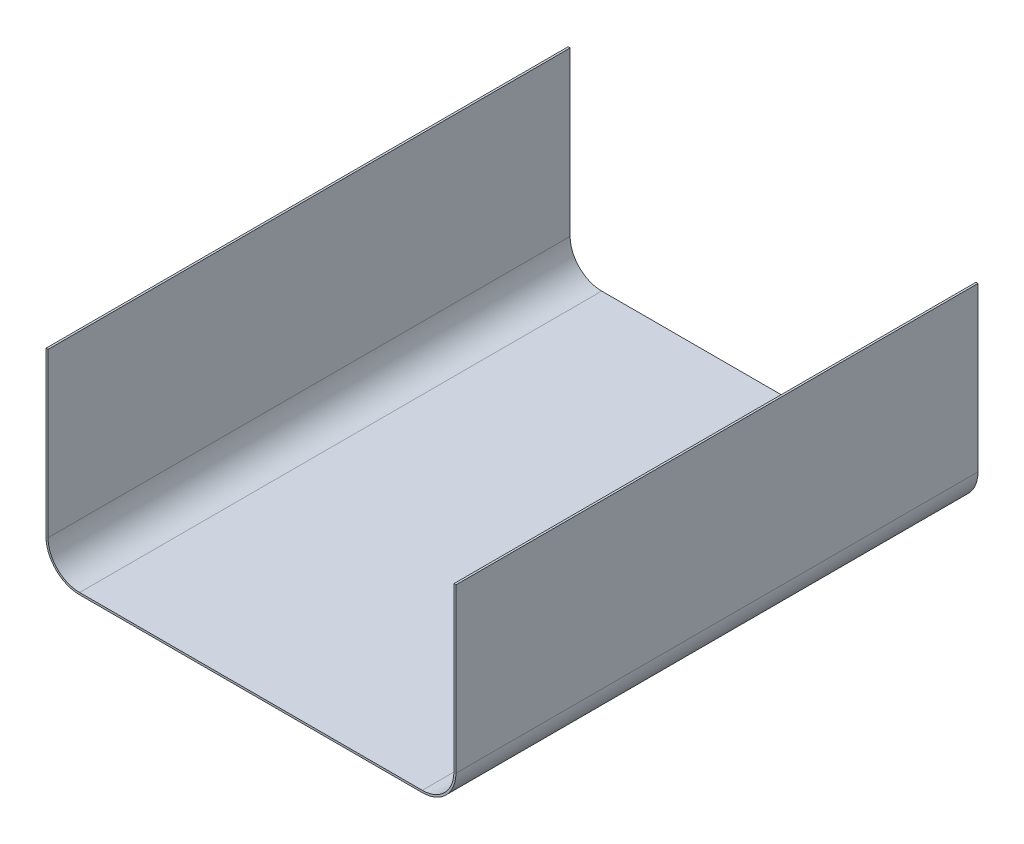
ISO-10303-21;
HEADER;
FILE_DESCRIPTION(('STEP AP214'),'2;1');
FILE_NAME('part.step','',(''),(''),'','','');
FILE_SCHEMA(('AUTOMOTIVE_DESIGN { 1 0 10303 214 1 1 1 1 }'));
ENDSEC;
DATA;
#1=APPLICATION_CONTEXT('core data for automotive mechanical design processes');
#2=APPLICATION_PROTOCOL_DEFINITION('international standard','automotive_design',2000,#1);
#3=PRODUCT_CONTEXT('',#1,'mechanical');
#4=PRODUCT('Part','Part','',(#3));
#5=PRODUCT_RELATED_PRODUCT_CATEGORY('part','',(#4));
#6=PRODUCT_DEFINITION_FORMATION('','',#4);
#7=PRODUCT_DEFINITION_CONTEXT('part definition',#1,'design');
#8=PRODUCT_DEFINITION('design','',#6,#7);
#9=PRODUCT_DEFINITION_SHAPE('','',#8);
#10=(LENGTH_UNIT() NAMED_UNIT(*) SI_UNIT(.MILLI.,.METRE.));
#11=(NAMED_UNIT(*) PLANE_ANGLE_UNIT() SI_UNIT($,.RADIAN.));
#12=(NAMED_UNIT(*) SI_UNIT($,.STERADIAN.) SOLID_ANGLE_UNIT());
#13=UNCERTAINTY_MEASURE_WITH_UNIT(LENGTH_MEASURE(1.E-05),#10,'distance_accuracy_value','');
#14=(GEOMETRIC_REPRESENTATION_CONTEXT(3) GLOBAL_UNCERTAINTY_ASSIGNED_CONTEXT((#13)) GLOBAL_UNIT_ASSIGNED_CONTEXT((#10,
#11,#12)) REPRESENTATION_CONTEXT('',''));
#15=CARTESIAN_POINT('',(0.,0.,0.));
#16=DIRECTION('',(0.,0.,1.));
#17=DIRECTION('',(1.,0.,0.));
#18=AXIS2_PLACEMENT_3D('',#15,#16,#17);
#19=CARTESIAN_POINT('',(0.,0.,406.4));
#20=DIRECTION('',(0.,1.,0.));
#21=DIRECTION('',(0.,0.,1.));
#22=AXIS2_PLACEMENT_3D('',#19,#20,#21);
#23=PLANE('',#22);
#24=DIRECTION('',(1.,0.,0.));
#25=VECTOR('',#24,1.);
#26=CARTESIAN_POINT('',(0.,0.,0.));
#27=LINE('',#26,#25);
#28=CARTESIAN_POINT('',(-0.79375,0.,0.));
#29=VERTEX_POINT('',#28);
#30=CARTESIAN_POINT('',(0.79375,0.,0.));
#31=VERTEX_POINT('',#30);
#32=EDGE_CURVE('E155',#29,#31,#27,.T.);
#33=ORIENTED_EDGE('',*,*,#32,.F.);
#34=DIRECTION('',(0.,0.,-1.));
#35=VECTOR('',#34,1.);
#36=CARTESIAN_POINT('',(-0.79375,0.,406.4));
#37=LINE('',#36,#35);
#38=CARTESIAN_POINT('',(-0.79375,0.,406.4));
#39=VERTEX_POINT('',#38);
#40=EDGE_CURVE('E11',#39,#29,#37,.T.);
#41=ORIENTED_EDGE('',*,*,#40,.F.);
#42=DIRECTION('',(1.,0.,0.));
#43=VECTOR('',#42,1.);
#44=CARTESIAN_POINT('',(0.,0.,406.4));
#45=LINE('',#44,#43);
#46=CARTESIAN_POINT('',(0.79375,0.,406.4));
#47=VERTEX_POINT('',#46);
#48=EDGE_CURVE('E185',#39,#47,#45,.T.);
#49=ORIENTED_EDGE('',*,*,#48,.T.);
#50=DIRECTION('',(0.,0.,-1.));
#51=VECTOR('',#50,1.);
#52=CARTESIAN_POINT('',(0.79375,0.,406.4));
#53=LINE('',#52,#51);
#54=EDGE_CURVE('E51',#47,#31,#53,.T.);
#55=ORIENTED_EDGE('',*,*,#54,.T.);
#56=EDGE_LOOP('',(#33,#41,#49,#55));
#57=FACE_BOUND('',#56,.T.);
#58=ADVANCED_FACE('F35',(#57),#23,.T.);
#59=CARTESIAN_POINT('',(-0.79375,0.,406.4));
#60=DIRECTION('',(1.,0.,0.));
#61=DIRECTION('',(0.,0.,-1.));
#62=AXIS2_PLACEMENT_3D('',#59,#60,#61);
#63=PLANE('',#62);
#64=DIRECTION('',(0.,-1.,0.));
#65=VECTOR('',#64,1.);
#66=CARTESIAN_POINT('',(-0.79375,0.,0.));
#67=LINE('',#66,#65);
#68=CARTESIAN_POINT('',(-0.79375,-127.,0.));
#69=VERTEX_POINT('',#68);
#70=EDGE_CURVE('E157',#29,#69,#67,.T.);
#71=ORIENTED_EDGE('',*,*,#70,.T.);
#72=DIRECTION('',(0.,0.,-1.));
#73=VECTOR('',#72,1.);
#74=CARTESIAN_POINT('',(-0.79375,-127.,406.4));
#75=LINE('',#74,#73);
#76=CARTESIAN_POINT('',(-0.79375,-127.,406.4));
#77=VERTEX_POINT('',#76);
#78=EDGE_CURVE('E43',#77,#69,#75,.T.);
#79=ORIENTED_EDGE('',*,*,#78,.F.);
#80=DIRECTION('',(0.,-1.,0.));
#81=VECTOR('',#80,1.);
#82=CARTESIAN_POINT('',(-0.79375,0.,406.4));
#83=LINE('',#82,#81);
#84=EDGE_CURVE('E368',#39,#77,#83,.T.);
#85=ORIENTED_EDGE('',*,*,#84,.F.);
#86=ORIENTED_EDGE('',*,*,#40,.T.);
#87=EDGE_LOOP('',(#71,#79,#85,#86));
#88=FACE_BOUND('',#87,.T.);
#89=ADVANCED_FACE('F211',(#88),#63,.F.);
#90=CARTESIAN_POINT('',(25.4,-127.,406.4));
#91=DIRECTION('',(0.,0.,-1.));
#92=DIRECTION('',(-1.,0.,0.));
#93=AXIS2_PLACEMENT_3D('',#90,#91,#92);
#94=CYLINDRICAL_SURFACE('',#93,26.19375);
#95=CARTESIAN_POINT('',(25.4,-127.,0.));
#96=DIRECTION('',(0.,0.,1.));
#97=DIRECTION('',(1.,0.,0.));
#98=AXIS2_PLACEMENT_3D('',#95,#96,#97);
#99=CIRCLE('',#98,26.19375);
#100=CARTESIAN_POINT('',(25.4000000000002,-153.19375,0.));
#101=VERTEX_POINT('',#100);
#102=EDGE_CURVE('E160',#101,#69,#99,.F.);
#103=ORIENTED_EDGE('',*,*,#102,.F.);
#104=DIRECTION('',(0.,0.,-1.));
#105=VECTOR('',#104,1.);
#106=CARTESIAN_POINT('',(25.4000000000002,-153.19375,406.4));
#107=LINE('',#106,#105);
#108=CARTESIAN_POINT('',(25.4000000000002,-153.19375,406.4));
#109=VERTEX_POINT('',#108);
#110=EDGE_CURVE('E201',#109,#101,#107,.T.);
#111=ORIENTED_EDGE('',*,*,#110,.F.);
#112=CARTESIAN_POINT('',(25.4,-127.,406.4));
#113=DIRECTION('',(0.,0.,1.));
#114=DIRECTION('',(1.,0.,0.));
#115=AXIS2_PLACEMENT_3D('',#112,#113,#114);
#116=CIRCLE('',#115,26.19375);
#117=EDGE_CURVE('E208',#109,#77,#116,.F.);
#118=ORIENTED_EDGE('',*,*,#117,.T.);
#119=ORIENTED_EDGE('',*,*,#78,.T.);
#120=EDGE_LOOP('',(#103,#111,#118,#119));
#121=FACE_BOUND('',#120,.T.);
#122=ADVANCED_FACE('F206',(#121),#94,.T.);
#123=CARTESIAN_POINT('',(0.,-153.19375,406.4));
#124=DIRECTION('',(0.,1.,0.));
#125=DIRECTION('',(0.,0.,1.));
#126=AXIS2_PLACEMENT_3D('',#123,#124,#125);
#127=PLANE('',#126);
#128=DIRECTION('',(1.,0.,0.));
#129=VECTOR('',#128,1.);
#130=CARTESIAN_POINT('',(0.,-153.19375,0.));
#131=LINE('',#130,#129);
#132=CARTESIAN_POINT('',(292.1,-153.19375,0.));
#133=VERTEX_POINT('',#132);
#134=EDGE_CURVE('E163',#101,#133,#131,.T.);
#135=ORIENTED_EDGE('',*,*,#134,.T.);
#136=DIRECTION('',(0.,0.,-1.));
#137=VECTOR('',#136,1.);
#138=CARTESIAN_POINT('',(292.1,-153.19375,406.4));
#139=LINE('',#138,#137);
#140=CARTESIAN_POINT('',(292.1,-153.19375,406.4));
#141=VERTEX_POINT('',#140);
#142=EDGE_CURVE('E198',#141,#133,#139,.T.);
#143=ORIENTED_EDGE('',*,*,#142,.F.);
#144=DIRECTION('',(1.,0.,0.));
#145=VECTOR('',#144,1.);
#146=CARTESIAN_POINT('',(0.,-153.19375,406.4));
#147=LINE('',#146,#145);
#148=EDGE_CURVE('E228',#109,#141,#147,.T.);
#149=ORIENTED_EDGE('',*,*,#148,.F.);
#150=ORIENTED_EDGE('',*,*,#110,.T.);
#151=EDGE_LOOP('',(#135,#143,#149,#150));
#152=FACE_BOUND('',#151,.T.);
#153=ADVANCED_FACE('F219',(#152),#127,.F.);
#154=CARTESIAN_POINT('',(292.1,-127.,406.4));
#155=DIRECTION('',(0.,0.,-1.));
#156=DIRECTION('',(-1.,0.,0.));
#157=AXIS2_PLACEMENT_3D('',#154,#155,#156);
#158=CYLINDRICAL_SURFACE('',#157,26.19375);
#159=CARTESIAN_POINT('',(292.1,-127.,0.));
#160=DIRECTION('',(0.,0.,1.));
#161=DIRECTION('',(1.,0.,0.));
#162=AXIS2_PLACEMENT_3D('',#159,#160,#161);
#163=CIRCLE('',#162,26.19375);
#164=CARTESIAN_POINT('',(318.29375,-127.,0.));
#165=VERTEX_POINT('',#164);
#166=EDGE_CURVE('E165',#133,#165,#163,.T.);
#167=ORIENTED_EDGE('',*,*,#166,.T.);
#168=DIRECTION('',(0.,0.,-1.));
#169=VECTOR('',#168,1.);
#170=CARTESIAN_POINT('',(318.29375,-127.,406.4));
#171=LINE('',#170,#169);
#172=CARTESIAN_POINT('',(318.29375,-127.,406.4));
#173=VERTEX_POINT('',#172);
#174=EDGE_CURVE('E195',#173,#165,#171,.T.);
#175=ORIENTED_EDGE('',*,*,#174,.F.);
#176=CARTESIAN_POINT('',(292.1,-127.,406.4));
#177=DIRECTION('',(0.,0.,1.));
#178=DIRECTION('',(1.,0.,0.));
#179=AXIS2_PLACEMENT_3D('',#176,#177,#178);
#180=CIRCLE('',#179,26.19375);
#181=EDGE_CURVE('E225',#141,#173,#180,.T.);
#182=ORIENTED_EDGE('',*,*,#181,.F.);
#183=ORIENTED_EDGE('',*,*,#142,.T.);
#184=EDGE_LOOP('',(#167,#175,#182,#183));
#185=FACE_BOUND('',#184,.T.);
#186=ADVANCED_FACE('F223',(#185),#158,.T.);
#187=CARTESIAN_POINT('',(318.29375,0.,406.4));
#188=DIRECTION('',(-1.,0.,0.));
#189=DIRECTION('',(0.,0.,1.));
#190=AXIS2_PLACEMENT_3D('',#187,#188,#189);
#191=PLANE('',#190);
#192=DIRECTION('',(0.,1.,0.));
#193=VECTOR('',#192,1.);
#194=CARTESIAN_POINT('',(318.29375,0.,0.));
#195=LINE('',#194,#193);
#196=CARTESIAN_POINT('',(318.29375,0.,0.));
#197=VERTEX_POINT('',#196);
#198=EDGE_CURVE('E167',#165,#197,#195,.T.);
#199=ORIENTED_EDGE('',*,*,#198,.T.);
#200=DIRECTION('',(0.,0.,-1.));
#201=VECTOR('',#200,1.);
#202=CARTESIAN_POINT('',(318.29375,0.,406.4));
#203=LINE('',#202,#201);
#204=CARTESIAN_POINT('',(318.29375,0.,406.4));
#205=VERTEX_POINT('',#204);
#206=EDGE_CURVE('E193',#205,#197,#203,.T.);
#207=ORIENTED_EDGE('',*,*,#206,.F.);
#208=DIRECTION('',(0.,1.,0.));
#209=VECTOR('',#208,1.);
#210=CARTESIAN_POINT('',(318.29375,0.,406.4));
#211=LINE('',#210,#209);
#212=EDGE_CURVE('E227',#173,#205,#211,.T.);
#213=ORIENTED_EDGE('',*,*,#212,.F.);
#214=ORIENTED_EDGE('',*,*,#174,.T.);
#215=EDGE_LOOP('',(#199,#207,#213,#214));
#216=FACE_BOUND('',#215,.T.);
#217=ADVANCED_FACE('F268',(#216),#191,.F.);
#218=CARTESIAN_POINT('',(0.,0.,406.4));
#219=DIRECTION('',(0.,1.,0.));
#220=DIRECTION('',(0.,0.,1.));
#221=AXIS2_PLACEMENT_3D('',#218,#219,#220);
#222=PLANE('',#221);
#223=DIRECTION('',(1.,0.,0.));
#224=VECTOR('',#223,1.);
#225=CARTESIAN_POINT('',(0.,0.,0.));
#226=LINE('',#225,#224);
#227=CARTESIAN_POINT('',(316.70625,0.,0.));
#228=VERTEX_POINT('',#227);
#229=EDGE_CURVE('E170',#228,#197,#226,.T.);
#230=ORIENTED_EDGE('',*,*,#229,.F.);
#231=DIRECTION('',(0.,0.,-1.));
#232=VECTOR('',#231,1.);
#233=CARTESIAN_POINT('',(316.70625,0.,406.4));
#234=LINE('',#233,#232);
#235=CARTESIAN_POINT('',(316.70625,0.,406.4));
#236=VERTEX_POINT('',#235);
#237=EDGE_CURVE('E191',#236,#228,#234,.T.);
#238=ORIENTED_EDGE('',*,*,#237,.F.);
#239=DIRECTION('',(1.,0.,0.));
#240=VECTOR('',#239,1.);
#241=CARTESIAN_POINT('',(0.,0.,406.4));
#242=LINE('',#241,#240);
#243=EDGE_CURVE('E230',#236,#205,#242,.T.);
#244=ORIENTED_EDGE('',*,*,#243,.T.);
#245=ORIENTED_EDGE('',*,*,#206,.T.);
#246=EDGE_LOOP('',(#230,#238,#244,#245));
#247=FACE_BOUND('',#246,.T.);
#248=ADVANCED_FACE('F271',(#247),#222,.T.);
#249=CARTESIAN_POINT('',(316.70625,0.,406.4));
#250=DIRECTION('',(-1.,0.,0.));
#251=DIRECTION('',(0.,0.,1.));
#252=AXIS2_PLACEMENT_3D('',#249,#250,#251);
#253=PLANE('',#252);
#254=DIRECTION('',(0.,1.,0.));
#255=VECTOR('',#254,1.);
#256=CARTESIAN_POINT('',(316.70625,0.,0.));
#257=LINE('',#256,#255);
#258=CARTESIAN_POINT('',(316.70625,-127.,0.));
#259=VERTEX_POINT('',#258);
#260=EDGE_CURVE('E173',#259,#228,#257,.T.);
#261=ORIENTED_EDGE('',*,*,#260,.F.);
#262=DIRECTION('',(0.,0.,-1.));
#263=VECTOR('',#262,1.);
#264=CARTESIAN_POINT('',(316.70625,-127.,406.4));
#265=LINE('',#264,#263);
#266=CARTESIAN_POINT('',(316.70625,-127.,406.4));
#267=VERTEX_POINT('',#266);
#268=EDGE_CURVE('E189',#267,#259,#265,.T.);
#269=ORIENTED_EDGE('',*,*,#268,.F.);
#270=DIRECTION('',(0.,1.,0.));
#271=VECTOR('',#270,1.);
#272=CARTESIAN_POINT('',(316.70625,0.,406.4));
#273=LINE('',#272,#271);
#274=EDGE_CURVE('E150',#267,#236,#273,.T.);
#275=ORIENTED_EDGE('',*,*,#274,.T.);
#276=ORIENTED_EDGE('',*,*,#237,.T.);
#277=EDGE_LOOP('',(#261,#269,#275,#276));
#278=FACE_BOUND('',#277,.T.);
#279=ADVANCED_FACE('F239',(#278),#253,.T.);
#280=CARTESIAN_POINT('',(292.1,-127.,406.4));
#281=DIRECTION('',(0.,0.,-1.));
#282=DIRECTION('',(-1.,0.,0.));
#283=AXIS2_PLACEMENT_3D('',#280,#281,#282);
#284=CYLINDRICAL_SURFACE('',#283,24.60625);
#285=CARTESIAN_POINT('',(292.1,-127.,0.));
#286=DIRECTION('',(0.,0.,1.));
#287=DIRECTION('',(1.,0.,0.));
#288=AXIS2_PLACEMENT_3D('',#285,#286,#287);
#289=CIRCLE('',#288,24.60625);
#290=CARTESIAN_POINT('',(292.1,-151.60625,0.));
#291=VERTEX_POINT('',#290);
#292=EDGE_CURVE('E176',#291,#259,#289,.T.);
#293=ORIENTED_EDGE('',*,*,#292,.F.);
#294=DIRECTION('',(0.,0.,-1.));
#295=VECTOR('',#294,1.);
#296=CARTESIAN_POINT('',(292.1,-151.60625,406.4));
#297=LINE('',#296,#295);
#298=CARTESIAN_POINT('',(292.1,-151.60625,406.4));
#299=VERTEX_POINT('',#298);
#300=EDGE_CURVE('E135',#299,#291,#297,.T.);
#301=ORIENTED_EDGE('',*,*,#300,.F.);
#302=CARTESIAN_POINT('',(292.1,-127.,406.4));
#303=DIRECTION('',(0.,0.,1.));
#304=DIRECTION('',(1.,0.,0.));
#305=AXIS2_PLACEMENT_3D('',#302,#303,#304);
#306=CIRCLE('',#305,24.60625);
#307=EDGE_CURVE('E148',#299,#267,#306,.T.);
#308=ORIENTED_EDGE('',*,*,#307,.T.);
#309=ORIENTED_EDGE('',*,*,#268,.T.);
#310=EDGE_LOOP('',(#293,#301,#308,#309));
#311=FACE_BOUND('',#310,.T.);
#312=ADVANCED_FACE('F244',(#311),#284,.F.);
#313=CARTESIAN_POINT('',(0.,-151.60625,406.4));
#314=DIRECTION('',(0.,1.,0.));
#315=DIRECTION('',(0.,0.,1.));
#316=AXIS2_PLACEMENT_3D('',#313,#314,#315);
#317=PLANE('',#316);
#318=DIRECTION('',(1.,0.,0.));
#319=VECTOR('',#318,1.);
#320=CARTESIAN_POINT('',(0.,-151.60625,0.));
#321=LINE('',#320,#319);
#322=CARTESIAN_POINT('',(25.4000000000002,-151.60625,0.));
#323=VERTEX_POINT('',#322);
#324=EDGE_CURVE('E132',#323,#291,#321,.T.);
#325=ORIENTED_EDGE('',*,*,#324,.F.);
#326=DIRECTION('',(0.,0.,-1.));
#327=VECTOR('',#326,1.);
#328=CARTESIAN_POINT('',(25.4000000000002,-151.60625,406.4));
#329=LINE('',#328,#327);
#330=CARTESIAN_POINT('',(25.4000000000002,-151.60625,406.4));
#331=VERTEX_POINT('',#330);
#332=EDGE_CURVE('E126',#331,#323,#329,.T.);
#333=ORIENTED_EDGE('',*,*,#332,.F.);
#334=DIRECTION('',(1.,0.,0.));
#335=VECTOR('',#334,1.);
#336=CARTESIAN_POINT('',(0.,-151.60625,406.4));
#337=LINE('',#336,#335);
#338=EDGE_CURVE('E130',#331,#299,#337,.T.);
#339=ORIENTED_EDGE('',*,*,#338,.T.);
#340=ORIENTED_EDGE('',*,*,#300,.T.);
#341=EDGE_LOOP('',(#325,#333,#339,#340));
#342=FACE_BOUND('',#341,.T.);
#343=ADVANCED_FACE('F128',(#342),#317,.T.);
#344=CARTESIAN_POINT('',(25.4,-127.,406.4));
#345=DIRECTION('',(0.,0.,-1.));
#346=DIRECTION('',(-1.,0.,0.));
#347=AXIS2_PLACEMENT_3D('',#344,#345,#346);
#348=CYLINDRICAL_SURFACE('',#347,24.60625);
#349=CARTESIAN_POINT('',(25.4,-127.,0.));
#350=DIRECTION('',(0.,0.,1.));
#351=DIRECTION('',(1.,0.,0.));
#352=AXIS2_PLACEMENT_3D('',#349,#350,#351);
#353=CIRCLE('',#352,24.60625);
#354=CARTESIAN_POINT('',(0.79375,-127.,0.));
#355=VERTEX_POINT('',#354);
#356=EDGE_CURVE('E180',#323,#355,#353,.F.);
#357=ORIENTED_EDGE('',*,*,#356,.T.);
#358=DIRECTION('',(0.,0.,-1.));
#359=VECTOR('',#358,1.);
#360=CARTESIAN_POINT('',(0.79375,-127.,406.4));
#361=LINE('',#360,#359);
#362=CARTESIAN_POINT('',(0.79375,-127.,406.4));
#363=VERTEX_POINT('',#362);
#364=EDGE_CURVE('E89',#363,#355,#361,.T.);
#365=ORIENTED_EDGE('',*,*,#364,.F.);
#366=CARTESIAN_POINT('',(25.4,-127.,406.4));
#367=DIRECTION('',(0.,0.,1.));
#368=DIRECTION('',(1.,0.,0.));
#369=AXIS2_PLACEMENT_3D('',#366,#367,#368);
#370=CIRCLE('',#369,24.60625);
#371=EDGE_CURVE('E137',#331,#363,#370,.F.);
#372=ORIENTED_EDGE('',*,*,#371,.F.);
#373=ORIENTED_EDGE('',*,*,#332,.T.);
#374=EDGE_LOOP('',(#357,#365,#372,#373));
#375=FACE_BOUND('',#374,.T.);
#376=ADVANCED_FACE('F138',(#375),#348,.F.);
#377=CARTESIAN_POINT('',(0.79375,0.,406.4));
#378=DIRECTION('',(1.,0.,0.));
#379=DIRECTION('',(0.,0.,-1.));
#380=AXIS2_PLACEMENT_3D('',#377,#378,#379);
#381=PLANE('',#380);
#382=DIRECTION('',(0.,-1.,0.));
#383=VECTOR('',#382,1.);
#384=CARTESIAN_POINT('',(0.79375,0.,0.));
#385=LINE('',#384,#383);
#386=EDGE_CURVE('E182',#31,#355,#385,.T.);
#387=ORIENTED_EDGE('',*,*,#386,.F.);
#388=ORIENTED_EDGE('',*,*,#54,.F.);
#389=DIRECTION('',(0.,-1.,0.));
#390=VECTOR('',#389,1.);
#391=CARTESIAN_POINT('',(0.79375,0.,406.4));
#392=LINE('',#391,#390);
#393=EDGE_CURVE('E141',#47,#363,#392,.T.);
#394=ORIENTED_EDGE('',*,*,#393,.T.);
#395=ORIENTED_EDGE('',*,*,#364,.T.);
#396=EDGE_LOOP('',(#387,#388,#394,#395));
#397=FACE_BOUND('',#396,.T.);
#398=ADVANCED_FACE('F245',(#397),#381,.T.);
#399=CARTESIAN_POINT('',(0.,0.,406.4));
#400=DIRECTION('',(0.,0.,1.));
#401=DIRECTION('',(1.,0.,0.));
#402=AXIS2_PLACEMENT_3D('',#399,#400,#401);
#403=PLANE('',#402);
#404=ORIENTED_EDGE('',*,*,#48,.F.);
#405=ORIENTED_EDGE('',*,*,#84,.T.);
#406=ORIENTED_EDGE('',*,*,#117,.F.);
#407=ORIENTED_EDGE('',*,*,#148,.T.);
#408=ORIENTED_EDGE('',*,*,#181,.T.);
#409=ORIENTED_EDGE('',*,*,#212,.T.);
#410=ORIENTED_EDGE('',*,*,#243,.F.);
#411=ORIENTED_EDGE('',*,*,#274,.F.);
#412=ORIENTED_EDGE('',*,*,#307,.F.);
#413=ORIENTED_EDGE('',*,*,#338,.F.);
#414=ORIENTED_EDGE('',*,*,#371,.T.);
#415=ORIENTED_EDGE('',*,*,#393,.F.);
#416=EDGE_LOOP('',(#404,#405,#406,#407,#408,#409,#410,#411,#412,#413,#414,#415));
#417=FACE_BOUND('',#416,.T.);
#418=ADVANCED_FACE('F145',(#417),#403,.T.);
#419=CARTESIAN_POINT('',(0.,0.,0.));
#420=DIRECTION('',(0.,0.,1.));
#421=DIRECTION('',(1.,0.,0.));
#422=AXIS2_PLACEMENT_3D('',#419,#420,#421);
#423=PLANE('',#422);
#424=ORIENTED_EDGE('',*,*,#32,.T.);
#425=ORIENTED_EDGE('',*,*,#386,.T.);
#426=ORIENTED_EDGE('',*,*,#356,.F.);
#427=ORIENTED_EDGE('',*,*,#324,.T.);
#428=ORIENTED_EDGE('',*,*,#292,.T.);
#429=ORIENTED_EDGE('',*,*,#260,.T.);
#430=ORIENTED_EDGE('',*,*,#229,.T.);
#431=ORIENTED_EDGE('',*,*,#198,.F.);
#432=ORIENTED_EDGE('',*,*,#166,.F.);
#433=ORIENTED_EDGE('',*,*,#134,.F.);
#434=ORIENTED_EDGE('',*,*,#102,.T.);
#435=ORIENTED_EDGE('',*,*,#70,.F.);
#436=EDGE_LOOP('',(#424,#425,#426,#427,#428,#429,#430,#431,#432,#433,#434,#435));
#437=FACE_BOUND('',#436,.T.);
#438=ADVANCED_FACE('F214',(#437),#423,.F.);
#439=CLOSED_SHELL('',(#58,#89,#122,#153,#186,#217,#248,#279,#312,#343,#376,#398,#418,#438));
#440=MANIFOLD_SOLID_BREP('B2',#439);
#441=ADVANCED_BREP_SHAPE_REPRESENTATION('',(#18,#440),#14);
#442=SHAPE_DEFINITION_REPRESENTATION(#9,#441);
ENDSEC;
END-ISO-10303-21;
